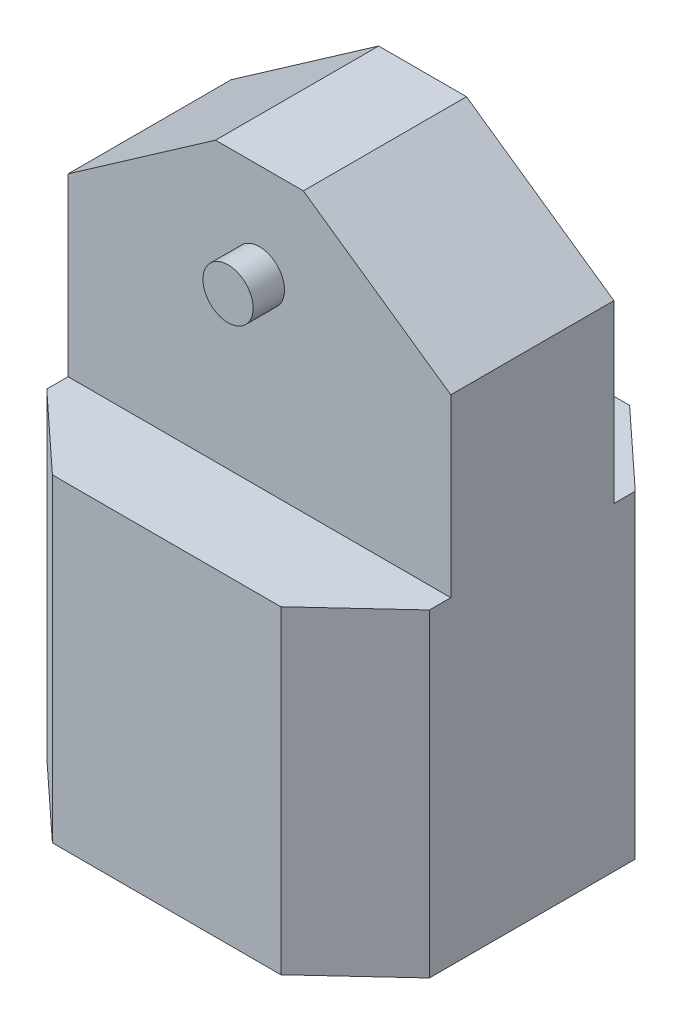
ISO-10303-21;
HEADER;
FILE_DESCRIPTION(('STEP AP214'),'2;1');
FILE_NAME('part.step','',(''),(''),'','','');
FILE_SCHEMA(('AUTOMOTIVE_DESIGN { 1 0 10303 214 1 1 1 1 }'));
ENDSEC;
DATA;
#1=APPLICATION_CONTEXT('core data for automotive mechanical design processes');
#2=APPLICATION_PROTOCOL_DEFINITION('international standard','automotive_design',2000,#1);
#3=PRODUCT_CONTEXT('',#1,'mechanical');
#4=PRODUCT('Part','Part','',(#3));
#5=PRODUCT_RELATED_PRODUCT_CATEGORY('part','',(#4));
#6=PRODUCT_DEFINITION_FORMATION('','',#4);
#7=PRODUCT_DEFINITION_CONTEXT('part definition',#1,'design');
#8=PRODUCT_DEFINITION('design','',#6,#7);
#9=PRODUCT_DEFINITION_SHAPE('','',#8);
#10=(LENGTH_UNIT() NAMED_UNIT(*) SI_UNIT(.MILLI.,.METRE.));
#11=(NAMED_UNIT(*) PLANE_ANGLE_UNIT() SI_UNIT($,.RADIAN.));
#12=(NAMED_UNIT(*) SI_UNIT($,.STERADIAN.) SOLID_ANGLE_UNIT());
#13=UNCERTAINTY_MEASURE_WITH_UNIT(LENGTH_MEASURE(1.E-05),#10,'distance_accuracy_value','');
#14=(GEOMETRIC_REPRESENTATION_CONTEXT(3) GLOBAL_UNCERTAINTY_ASSIGNED_CONTEXT((#13)) GLOBAL_UNIT_ASSIGNED_CONTEXT((#10,
#11,#12)) REPRESENTATION_CONTEXT('',''));
#15=CARTESIAN_POINT('',(0.,0.,0.));
#16=DIRECTION('',(0.,0.,1.));
#17=DIRECTION('',(1.,0.,0.));
#18=AXIS2_PLACEMENT_3D('',#15,#16,#17);
#19=CARTESIAN_POINT('',(0.806948497943091,-50.,4.08352127397604));
#20=DIRECTION('',(0.,1.,0.));
#21=DIRECTION('',(0.,0.,1.));
#22=AXIS2_PLACEMENT_3D('',#19,#20,#21);
#23=CYLINDRICAL_SURFACE('',#22,21.);
#24=CARTESIAN_POINT('',(0.806948497943091,-50.,4.08352127397604));
#25=DIRECTION('',(0.,-1.,0.));
#26=DIRECTION('',(0.,0.,-1.));
#27=AXIS2_PLACEMENT_3D('',#24,#25,#26);
#28=CIRCLE('',#27,21.);
#29=CARTESIAN_POINT('',(0.806948497943091,-50.,-16.916478726024));
#30=VERTEX_POINT('',#29);
#31=EDGE_CURVE('E11',#30,#30,#28,.T.);
#32=ORIENTED_EDGE('',*,*,#31,.F.);
#33=EDGE_LOOP('',(#32));
#34=FACE_BOUND('',#33,.T.);
#35=CARTESIAN_POINT('',(0.806948497943091,0.,4.08352127397604));
#36=DIRECTION('',(0.,-1.,0.));
#37=DIRECTION('',(0.,0.,-1.));
#38=AXIS2_PLACEMENT_3D('',#35,#36,#37);
#39=CIRCLE('',#38,21.);
#40=CARTESIAN_POINT('',(0.806948497943091,0.,-16.916478726024));
#41=VERTEX_POINT('',#40);
#42=EDGE_CURVE('E44',#41,#41,#39,.T.);
#43=ORIENTED_EDGE('',*,*,#42,.T.);
#44=EDGE_LOOP('',(#43));
#45=FACE_BOUND('',#44,.T.);
#46=ADVANCED_FACE('F41',(#34,#45),#23,.T.);
#47=CARTESIAN_POINT('',(0.806948497943091,-50.,4.08352127397604));
#48=DIRECTION('',(0.,-1.,0.));
#49=DIRECTION('',(0.,0.,-1.));
#50=AXIS2_PLACEMENT_3D('',#47,#48,#49);
#51=PLANE('',#50);
#52=ORIENTED_EDGE('',*,*,#31,.T.);
#53=EDGE_LOOP('',(#52));
#54=FACE_BOUND('',#53,.T.);
#55=ADVANCED_FACE('F56',(#54),#51,.T.);
#56=CARTESIAN_POINT('',(0.806948497943091,0.,4.08352127397604));
#57=DIRECTION('',(0.,-1.,0.));
#58=DIRECTION('',(0.,0.,-1.));
#59=AXIS2_PLACEMENT_3D('',#56,#57,#58);
#60=PLANE('',#59);
#61=ORIENTED_EDGE('',*,*,#42,.F.);
#62=EDGE_LOOP('',(#61));
#63=FACE_BOUND('',#62,.T.);
#64=ADVANCED_FACE('F54',(#63),#60,.F.);
#65=CLOSED_SHELL('',(#46,#55,#64));
#66=MANIFOLD_SOLID_BREP('B2',#65);
#67=CARTESIAN_POINT('',(153.306948497943,520.735506726257,69.0835212739761));
#68=DIRECTION('',(0.,0.,-1.));
#69=DIRECTION('',(0.,1.,0.));
#70=AXIS2_PLACEMENT_3D('',#67,#68,#69);
#71=PLANE('',#70);
#72=DIRECTION('',(0.,-1.,0.));
#73=VECTOR('',#72,1.);
#74=CARTESIAN_POINT('',(153.306948497943,520.735506726257,69.0835212739761));
#75=LINE('',#74,#73);
#76=CARTESIAN_POINT('',(153.306948497943,394.,69.0835212739761));
#77=VERTEX_POINT('',#76);
#78=CARTESIAN_POINT('',(153.306948497943,254.,69.0835212739761));
#79=VERTEX_POINT('',#78);
#80=EDGE_CURVE('E197',#77,#79,#75,.T.);
#81=ORIENTED_EDGE('',*,*,#80,.F.);
#82=DIRECTION('',(0.82005078309651,-0.572290759267351,0.));
#83=VECTOR('',#82,1.);
#84=CARTESIAN_POINT('',(153.306948497943,394.,69.0835212739761));
#85=LINE('',#84,#83);
#86=CARTESIAN_POINT('',(35.8069484979431,476.,69.0835212739761));
#87=VERTEX_POINT('',#86);
#88=EDGE_CURVE('E186',#87,#77,#85,.T.);
#89=ORIENTED_EDGE('',*,*,#88,.F.);
#90=DIRECTION('',(1.,0.,0.));
#91=VECTOR('',#90,1.);
#92=CARTESIAN_POINT('',(0.80694849794305,476.,69.083521273976));
#93=LINE('',#92,#91);
#94=CARTESIAN_POINT('',(-34.1930515020569,476.,69.0835212739761));
#95=VERTEX_POINT('',#94);
#96=EDGE_CURVE('E195',#95,#87,#93,.T.);
#97=ORIENTED_EDGE('',*,*,#96,.F.);
#98=DIRECTION('',(0.82005078309651,0.572290759267351,0.));
#99=VECTOR('',#98,1.);
#100=CARTESIAN_POINT('',(-151.693051502057,394.,69.0835212739761));
#101=LINE('',#100,#99);
#102=CARTESIAN_POINT('',(-151.693051502057,394.,69.0835212739761));
#103=VERTEX_POINT('',#102);
#104=EDGE_CURVE('E359',#103,#95,#101,.T.);
#105=ORIENTED_EDGE('',*,*,#104,.F.);
#106=DIRECTION('',(0.,-1.,0.));
#107=VECTOR('',#106,1.);
#108=CARTESIAN_POINT('',(-151.693051502057,520.735506726257,69.0835212739761));
#109=LINE('',#108,#107);
#110=CARTESIAN_POINT('',(-151.693051502057,254.,69.0835212739761));
#111=VERTEX_POINT('',#110);
#112=EDGE_CURVE('E333',#103,#111,#109,.T.);
#113=ORIENTED_EDGE('',*,*,#112,.T.);
#114=DIRECTION('',(-1.,0.,0.));
#115=VECTOR('',#114,1.);
#116=CARTESIAN_POINT('',(153.306948497943,254.,69.0835212739761));
#117=LINE('',#116,#115);
#118=EDGE_CURVE('E327',#79,#111,#117,.T.);
#119=ORIENTED_EDGE('',*,*,#118,.F.);
#120=EDGE_LOOP('',(#81,#89,#97,#105,#113,#119));
#121=FACE_BOUND('',#120,.T.);
#122=CARTESIAN_POINT('',(0.806948497943105,400.,69.0835212739761));
#123=DIRECTION('',(0.,0.,-1.));
#124=DIRECTION('',(0.,1.,0.));
#125=AXIS2_PLACEMENT_3D('',#122,#123,#124);
#126=CIRCLE('',#125,20.);
#127=CARTESIAN_POINT('',(-19.1930515020569,400.,69.0835212739761));
#128=VERTEX_POINT('',#127);
#129=EDGE_CURVE('E39',#128,#128,#126,.F.);
#130=ORIENTED_EDGE('',*,*,#129,.F.);
#131=EDGE_LOOP('',(#130));
#132=FACE_BOUND('',#131,.T.);
#133=ADVANCED_FACE('F82',(#121,#132),#71,.F.);
#134=CARTESIAN_POINT('',(153.306948497943,520.735506726257,-60.9164787260239));
#135=DIRECTION('',(0.,0.,1.));
#136=DIRECTION('',(0.,-1.,0.));
#137=AXIS2_PLACEMENT_3D('',#134,#135,#136);
#138=PLANE('',#137);
#139=DIRECTION('',(-1.,0.,0.));
#140=VECTOR('',#139,1.);
#141=CARTESIAN_POINT('',(0.80694849794305,476.,-60.916478726024));
#142=LINE('',#141,#140);
#143=CARTESIAN_POINT('',(35.8069484979431,476.,-60.916478726024));
#144=VERTEX_POINT('',#143);
#145=CARTESIAN_POINT('',(-34.1930515020569,476.,-60.916478726024));
#146=VERTEX_POINT('',#145);
#147=EDGE_CURVE('E106',#144,#146,#142,.T.);
#148=ORIENTED_EDGE('',*,*,#147,.F.);
#149=DIRECTION('',(0.82005078309651,-0.572290759267351,0.));
#150=VECTOR('',#149,1.);
#151=CARTESIAN_POINT('',(93.8290265385182,435.507996601471,-60.916478726024));
#152=LINE('',#151,#150);
#153=CARTESIAN_POINT('',(153.306948497943,394.,-60.916478726024));
#154=VERTEX_POINT('',#153);
#155=EDGE_CURVE('E187',#144,#154,#152,.T.);
#156=ORIENTED_EDGE('',*,*,#155,.T.);
#157=DIRECTION('',(0.,1.,0.));
#158=VECTOR('',#157,1.);
#159=CARTESIAN_POINT('',(153.306948497943,520.735506726257,-60.9164787260239));
#160=LINE('',#159,#158);
#161=CARTESIAN_POINT('',(153.306948497943,254.,-60.916478726024));
#162=VERTEX_POINT('',#161);
#163=EDGE_CURVE('E347',#162,#154,#160,.T.);
#164=ORIENTED_EDGE('',*,*,#163,.F.);
#165=DIRECTION('',(-1.,0.,0.));
#166=VECTOR('',#165,1.);
#167=CARTESIAN_POINT('',(153.306948497943,254.,-60.916478726024));
#168=LINE('',#167,#166);
#169=CARTESIAN_POINT('',(-151.693051502057,254.,-60.916478726024));
#170=VERTEX_POINT('',#169);
#171=EDGE_CURVE('E344',#162,#170,#168,.T.);
#172=ORIENTED_EDGE('',*,*,#171,.T.);
#173=DIRECTION('',(0.,1.,0.));
#174=VECTOR('',#173,1.);
#175=CARTESIAN_POINT('',(-151.693051502057,520.735506726257,-60.9164787260239));
#176=LINE('',#175,#174);
#177=CARTESIAN_POINT('',(-151.693051502057,394.,-60.916478726024));
#178=VERTEX_POINT('',#177);
#179=EDGE_CURVE('E348',#170,#178,#176,.T.);
#180=ORIENTED_EDGE('',*,*,#179,.T.);
#181=DIRECTION('',(0.82005078309651,0.572290759267351,0.));
#182=VECTOR('',#181,1.);
#183=CARTESIAN_POINT('',(112.892272948814,578.646779616778,-60.9164787260239));
#184=LINE('',#183,#182);
#185=EDGE_CURVE('E204',#178,#146,#184,.T.);
#186=ORIENTED_EDGE('',*,*,#185,.T.);
#187=EDGE_LOOP('',(#148,#156,#164,#172,#180,#186));
#188=FACE_BOUND('',#187,.T.);
#189=CARTESIAN_POINT('',(0.806948497943105,400.,-60.9164787260239));
#190=DIRECTION('',(0.,0.,1.));
#191=DIRECTION('',(0.,-1.,0.));
#192=AXIS2_PLACEMENT_3D('',#189,#190,#191);
#193=CIRCLE('',#192,20.);
#194=CARTESIAN_POINT('',(-19.1930515020569,400.,-60.9164787260239));
#195=VERTEX_POINT('',#194);
#196=EDGE_CURVE('E86',#195,#195,#193,.F.);
#197=ORIENTED_EDGE('',*,*,#196,.F.);
#198=EDGE_LOOP('',(#197));
#199=FACE_BOUND('',#198,.T.);
#200=ADVANCED_FACE('F219',(#188,#199),#138,.F.);
#201=CARTESIAN_POINT('',(153.306948497943,476.,-77.916478726024));
#202=DIRECTION('',(-0.679764665159936,0.,0.733430296619931));
#203=DIRECTION('',(0.733430296619931,0.,0.679764665159936));
#204=AXIS2_PLACEMENT_3D('',#201,#202,#203);
#205=PLANE('',#204);
#206=DIRECTION('',(0.,-1.,0.));
#207=VECTOR('',#206,1.);
#208=CARTESIAN_POINT('',(91.8069484979431,476.,-134.916478726024));
#209=LINE('',#208,#207);
#210=CARTESIAN_POINT('',(91.8069484979431,254.,-134.916478726024));
#211=VERTEX_POINT('',#210);
#212=CARTESIAN_POINT('',(91.8069484979431,0.,-134.916478726024));
#213=VERTEX_POINT('',#212);
#214=EDGE_CURVE('E202',#211,#213,#209,.T.);
#215=ORIENTED_EDGE('',*,*,#214,.F.);
#216=DIRECTION('',(0.733430296619931,0.,0.679764665159936));
#217=VECTOR('',#216,1.);
#218=CARTESIAN_POINT('',(153.306948497943,254.,-77.916478726024));
#219=LINE('',#218,#217);
#220=CARTESIAN_POINT('',(153.306948497943,254.,-77.916478726024));
#221=VERTEX_POINT('',#220);
#222=EDGE_CURVE('E335',#211,#221,#219,.T.);
#223=ORIENTED_EDGE('',*,*,#222,.T.);
#224=DIRECTION('',(0.,-1.,0.));
#225=VECTOR('',#224,1.);
#226=CARTESIAN_POINT('',(153.306948497943,476.,-77.916478726024));
#227=LINE('',#226,#225);
#228=CARTESIAN_POINT('',(153.306948497943,0.,-77.916478726024));
#229=VERTEX_POINT('',#228);
#230=EDGE_CURVE('E295',#221,#229,#227,.T.);
#231=ORIENTED_EDGE('',*,*,#230,.T.);
#232=DIRECTION('',(-0.733430296619931,0.,-0.679764665159936));
#233=VECTOR('',#232,1.);
#234=CARTESIAN_POINT('',(153.306948497943,0.,-77.916478726024));
#235=LINE('',#234,#233);
#236=EDGE_CURVE('E315',#229,#213,#235,.T.);
#237=ORIENTED_EDGE('',*,*,#236,.T.);
#238=EDGE_LOOP('',(#215,#223,#231,#237));
#239=FACE_BOUND('',#238,.T.);
#240=ADVANCED_FACE('F84',(#239),#205,.F.);
#241=CARTESIAN_POINT('',(-90.1930515020569,476.,-134.916478726024));
#242=DIRECTION('',(0.,0.,1.));
#243=DIRECTION('',(1.,0.,0.));
#244=AXIS2_PLACEMENT_3D('',#241,#242,#243);
#245=PLANE('',#244);
#246=DIRECTION('',(0.,-1.,0.));
#247=VECTOR('',#246,1.);
#248=CARTESIAN_POINT('',(-90.1930515020569,476.,-134.916478726024));
#249=LINE('',#248,#247);
#250=CARTESIAN_POINT('',(-90.1930515020569,254.,-134.916478726024));
#251=VERTEX_POINT('',#250);
#252=CARTESIAN_POINT('',(-90.1930515020569,0.,-134.916478726024));
#253=VERTEX_POINT('',#252);
#254=EDGE_CURVE('E206',#251,#253,#249,.T.);
#255=ORIENTED_EDGE('',*,*,#254,.F.);
#256=DIRECTION('',(1.,0.,0.));
#257=VECTOR('',#256,1.);
#258=CARTESIAN_POINT('',(-90.1930515020569,254.,-134.916478726024));
#259=LINE('',#258,#257);
#260=EDGE_CURVE('E277',#251,#211,#259,.T.);
#261=ORIENTED_EDGE('',*,*,#260,.T.);
#262=ORIENTED_EDGE('',*,*,#214,.T.);
#263=DIRECTION('',(-1.,0.,0.));
#264=VECTOR('',#263,1.);
#265=CARTESIAN_POINT('',(-90.1930515020569,0.,-134.916478726024));
#266=LINE('',#265,#264);
#267=EDGE_CURVE('E280',#213,#253,#266,.T.);
#268=ORIENTED_EDGE('',*,*,#267,.T.);
#269=EDGE_LOOP('',(#255,#261,#262,#268));
#270=FACE_BOUND('',#269,.T.);
#271=ADVANCED_FACE('F226',(#270),#245,.F.);
#272=CARTESIAN_POINT('',(-151.693051502057,476.,-77.916478726024));
#273=DIRECTION('',(0.679764665159936,0.,0.733430296619931));
#274=DIRECTION('',(0.733430296619931,0.,-0.679764665159936));
#275=AXIS2_PLACEMENT_3D('',#272,#273,#274);
#276=PLANE('',#275);
#277=DIRECTION('',(0.,-1.,0.));
#278=VECTOR('',#277,1.);
#279=CARTESIAN_POINT('',(-151.693051502057,476.,-77.916478726024));
#280=LINE('',#279,#278);
#281=CARTESIAN_POINT('',(-151.693051502057,254.,-77.916478726024));
#282=VERTEX_POINT('',#281);
#283=CARTESIAN_POINT('',(-151.693051502057,0.,-77.916478726024));
#284=VERTEX_POINT('',#283);
#285=EDGE_CURVE('E284',#282,#284,#280,.T.);
#286=ORIENTED_EDGE('',*,*,#285,.F.);
#287=DIRECTION('',(0.733430296619931,0.,-0.679764665159936));
#288=VECTOR('',#287,1.);
#289=CARTESIAN_POINT('',(-151.693051502057,254.,-77.916478726024));
#290=LINE('',#289,#288);
#291=EDGE_CURVE('E342',#282,#251,#290,.T.);
#292=ORIENTED_EDGE('',*,*,#291,.T.);
#293=ORIENTED_EDGE('',*,*,#254,.T.);
#294=DIRECTION('',(-0.733430296619931,0.,0.679764665159936));
#295=VECTOR('',#294,1.);
#296=CARTESIAN_POINT('',(-151.693051502057,0.,-77.916478726024));
#297=LINE('',#296,#295);
#298=EDGE_CURVE('E312',#253,#284,#297,.T.);
#299=ORIENTED_EDGE('',*,*,#298,.T.);
#300=EDGE_LOOP('',(#286,#292,#293,#299));
#301=FACE_BOUND('',#300,.T.);
#302=ADVANCED_FACE('F266',(#301),#276,.F.);
#303=CARTESIAN_POINT('',(-151.693051502057,476.,-77.916478726024));
#304=DIRECTION('',(1.,0.,0.));
#305=DIRECTION('',(0.,0.,-1.));
#306=AXIS2_PLACEMENT_3D('',#303,#304,#305);
#307=PLANE('',#306);
#308=ORIENTED_EDGE('',*,*,#112,.F.);
#309=DIRECTION('',(0.,0.,1.));
#310=VECTOR('',#309,1.);
#311=CARTESIAN_POINT('',(-151.693051502057,394.,-134.916478726024));
#312=LINE('',#311,#310);
#313=EDGE_CURVE('E357',#178,#103,#312,.T.);
#314=ORIENTED_EDGE('',*,*,#313,.F.);
#315=ORIENTED_EDGE('',*,*,#179,.F.);
#316=DIRECTION('',(0.,0.,1.));
#317=VECTOR('',#316,1.);
#318=CARTESIAN_POINT('',(-151.693051502057,254.,-60.916478726024));
#319=LINE('',#318,#317);
#320=EDGE_CURVE('E352',#282,#170,#319,.T.);
#321=ORIENTED_EDGE('',*,*,#320,.F.);
#322=ORIENTED_EDGE('',*,*,#285,.T.);
#323=DIRECTION('',(0.,0.,1.));
#324=VECTOR('',#323,1.);
#325=CARTESIAN_POINT('',(-151.693051502057,0.,-77.916478726024));
#326=LINE('',#325,#324);
#327=CARTESIAN_POINT('',(-151.693051502057,0.,86.0835212739761));
#328=VERTEX_POINT('',#327);
#329=EDGE_CURVE('E309',#284,#328,#326,.T.);
#330=ORIENTED_EDGE('',*,*,#329,.T.);
#331=DIRECTION('',(0.,-1.,0.));
#332=VECTOR('',#331,1.);
#333=CARTESIAN_POINT('',(-151.693051502057,476.,86.0835212739761));
#334=LINE('',#333,#332);
#335=CARTESIAN_POINT('',(-151.693051502057,254.,86.0835212739761));
#336=VERTEX_POINT('',#335);
#337=EDGE_CURVE('E285',#336,#328,#334,.T.);
#338=ORIENTED_EDGE('',*,*,#337,.F.);
#339=DIRECTION('',(0.,0.,1.));
#340=VECTOR('',#339,1.);
#341=CARTESIAN_POINT('',(-151.693051502057,254.,69.0835212739761));
#342=LINE('',#341,#340);
#343=EDGE_CURVE('E331',#111,#336,#342,.T.);
#344=ORIENTED_EDGE('',*,*,#343,.F.);
#345=EDGE_LOOP('',(#308,#314,#315,#321,#322,#330,#338,#344));
#346=FACE_BOUND('',#345,.T.);
#347=ADVANCED_FACE('F262',(#346),#307,.F.);
#348=CARTESIAN_POINT('',(-151.693051502057,476.,86.0835212739761));
#349=DIRECTION('',(0.679764665159936,0.,-0.733430296619931));
#350=DIRECTION('',(-0.733430296619931,0.,-0.679764665159936));
#351=AXIS2_PLACEMENT_3D('',#348,#349,#350);
#352=PLANE('',#351);
#353=DIRECTION('',(0.,-1.,0.));
#354=VECTOR('',#353,1.);
#355=CARTESIAN_POINT('',(-90.1930515020569,476.,143.083521273976));
#356=LINE('',#355,#354);
#357=CARTESIAN_POINT('',(-90.1930515020569,254.,143.083521273976));
#358=VERTEX_POINT('',#357);
#359=CARTESIAN_POINT('',(-90.1930515020569,0.,143.083521273976));
#360=VERTEX_POINT('',#359);
#361=EDGE_CURVE('E289',#358,#360,#356,.T.);
#362=ORIENTED_EDGE('',*,*,#361,.F.);
#363=DIRECTION('',(-0.733430296619931,0.,-0.679764665159936));
#364=VECTOR('',#363,1.);
#365=CARTESIAN_POINT('',(-151.693051502057,254.,86.0835212739761));
#366=LINE('',#365,#364);
#367=EDGE_CURVE('E318',#358,#336,#366,.T.);
#368=ORIENTED_EDGE('',*,*,#367,.T.);
#369=ORIENTED_EDGE('',*,*,#337,.T.);
#370=DIRECTION('',(0.733430296619931,0.,0.679764665159936));
#371=VECTOR('',#370,1.);
#372=CARTESIAN_POINT('',(-151.693051502057,0.,86.0835212739761));
#373=LINE('',#372,#371);
#374=EDGE_CURVE('E306',#328,#360,#373,.T.);
#375=ORIENTED_EDGE('',*,*,#374,.T.);
#376=EDGE_LOOP('',(#362,#368,#369,#375));
#377=FACE_BOUND('',#376,.T.);
#378=ADVANCED_FACE('F258',(#377),#352,.F.);
#379=CARTESIAN_POINT('',(-90.1930515020569,476.,143.083521273976));
#380=DIRECTION('',(0.,0.,-1.));
#381=DIRECTION('',(-1.,0.,0.));
#382=AXIS2_PLACEMENT_3D('',#379,#380,#381);
#383=PLANE('',#382);
#384=DIRECTION('',(0.,-1.,0.));
#385=VECTOR('',#384,1.);
#386=CARTESIAN_POINT('',(91.8069484979431,476.,143.083521273976));
#387=LINE('',#386,#385);
#388=CARTESIAN_POINT('',(91.8069484979431,254.,143.083521273976));
#389=VERTEX_POINT('',#388);
#390=CARTESIAN_POINT('',(91.8069484979431,0.,143.083521273976));
#391=VERTEX_POINT('',#390);
#392=EDGE_CURVE('E291',#389,#391,#387,.T.);
#393=ORIENTED_EDGE('',*,*,#392,.F.);
#394=DIRECTION('',(-1.,0.,0.));
#395=VECTOR('',#394,1.);
#396=CARTESIAN_POINT('',(-90.1930515020569,254.,143.083521273976));
#397=LINE('',#396,#395);
#398=EDGE_CURVE('E321',#389,#358,#397,.T.);
#399=ORIENTED_EDGE('',*,*,#398,.T.);
#400=ORIENTED_EDGE('',*,*,#361,.T.);
#401=DIRECTION('',(1.,0.,0.));
#402=VECTOR('',#401,1.);
#403=CARTESIAN_POINT('',(-90.1930515020569,0.,143.083521273976));
#404=LINE('',#403,#402);
#405=EDGE_CURVE('E303',#360,#391,#404,.T.);
#406=ORIENTED_EDGE('',*,*,#405,.T.);
#407=EDGE_LOOP('',(#393,#399,#400,#406));
#408=FACE_BOUND('',#407,.T.);
#409=ADVANCED_FACE('F254',(#408),#383,.F.);
#410=CARTESIAN_POINT('',(153.306948497943,476.,86.0835212739761));
#411=DIRECTION('',(-0.679764665159936,0.,-0.733430296619931));
#412=DIRECTION('',(-0.733430296619931,0.,0.679764665159936));
#413=AXIS2_PLACEMENT_3D('',#410,#411,#412);
#414=PLANE('',#413);
#415=DIRECTION('',(0.,-1.,0.));
#416=VECTOR('',#415,1.);
#417=CARTESIAN_POINT('',(153.306948497943,476.,86.0835212739761));
#418=LINE('',#417,#416);
#419=CARTESIAN_POINT('',(153.306948497943,254.,86.0835212739761));
#420=VERTEX_POINT('',#419);
#421=CARTESIAN_POINT('',(153.306948497943,0.,86.0835212739761));
#422=VERTEX_POINT('',#421);
#423=EDGE_CURVE('E293',#420,#422,#418,.T.);
#424=ORIENTED_EDGE('',*,*,#423,.F.);
#425=DIRECTION('',(-0.733430296619931,0.,0.679764665159936));
#426=VECTOR('',#425,1.);
#427=CARTESIAN_POINT('',(153.306948497943,254.,86.0835212739761));
#428=LINE('',#427,#426);
#429=EDGE_CURVE('E324',#420,#389,#428,.T.);
#430=ORIENTED_EDGE('',*,*,#429,.T.);
#431=ORIENTED_EDGE('',*,*,#392,.T.);
#432=DIRECTION('',(0.733430296619931,0.,-0.679764665159936));
#433=VECTOR('',#432,1.);
#434=CARTESIAN_POINT('',(153.306948497943,0.,86.0835212739761));
#435=LINE('',#434,#433);
#436=EDGE_CURVE('E300',#391,#422,#435,.T.);
#437=ORIENTED_EDGE('',*,*,#436,.T.);
#438=EDGE_LOOP('',(#424,#430,#431,#437));
#439=FACE_BOUND('',#438,.T.);
#440=ADVANCED_FACE('F250',(#439),#414,.F.);
#441=CARTESIAN_POINT('',(153.306948497943,476.,-77.916478726024));
#442=DIRECTION('',(-1.,0.,0.));
#443=DIRECTION('',(0.,0.,1.));
#444=AXIS2_PLACEMENT_3D('',#441,#442,#443);
#445=PLANE('',#444);
#446=ORIENTED_EDGE('',*,*,#163,.T.);
#447=DIRECTION('',(0.,0.,1.));
#448=VECTOR('',#447,1.);
#449=CARTESIAN_POINT('',(153.306948497943,394.,-134.916478726024));
#450=LINE('',#449,#448);
#451=EDGE_CURVE('E98',#154,#77,#450,.T.);
#452=ORIENTED_EDGE('',*,*,#451,.T.);
#453=ORIENTED_EDGE('',*,*,#80,.T.);
#454=DIRECTION('',(0.,0.,1.));
#455=VECTOR('',#454,1.);
#456=CARTESIAN_POINT('',(153.306948497943,254.,69.0835212739761));
#457=LINE('',#456,#455);
#458=EDGE_CURVE('E330',#79,#420,#457,.T.);
#459=ORIENTED_EDGE('',*,*,#458,.T.);
#460=ORIENTED_EDGE('',*,*,#423,.T.);
#461=DIRECTION('',(0.,0.,-1.));
#462=VECTOR('',#461,1.);
#463=CARTESIAN_POINT('',(153.306948497943,0.,-77.916478726024));
#464=LINE('',#463,#462);
#465=EDGE_CURVE('E297',#422,#229,#464,.T.);
#466=ORIENTED_EDGE('',*,*,#465,.T.);
#467=ORIENTED_EDGE('',*,*,#230,.F.);
#468=DIRECTION('',(0.,0.,1.));
#469=VECTOR('',#468,1.);
#470=CARTESIAN_POINT('',(153.306948497943,254.,-60.916478726024));
#471=LINE('',#470,#469);
#472=EDGE_CURVE('E351',#221,#162,#471,.T.);
#473=ORIENTED_EDGE('',*,*,#472,.T.);
#474=EDGE_LOOP('',(#446,#452,#453,#459,#460,#466,#467,#473));
#475=FACE_BOUND('',#474,.T.);
#476=ADVANCED_FACE('F244',(#475),#445,.F.);
#477=CARTESIAN_POINT('',(0.80694849794305,476.,-219.257942140658));
#478=DIRECTION('',(0.,-1.,0.));
#479=DIRECTION('',(0.,0.,-1.));
#480=AXIS2_PLACEMENT_3D('',#477,#478,#479);
#481=PLANE('',#480);
#482=ORIENTED_EDGE('',*,*,#96,.T.);
#483=DIRECTION('',(0.,0.,1.));
#484=VECTOR('',#483,1.);
#485=CARTESIAN_POINT('',(35.8069484979431,476.,-134.916478726024));
#486=LINE('',#485,#484);
#487=EDGE_CURVE('E183',#144,#87,#486,.T.);
#488=ORIENTED_EDGE('',*,*,#487,.F.);
#489=ORIENTED_EDGE('',*,*,#147,.T.);
#490=DIRECTION('',(0.,0.,1.));
#491=VECTOR('',#490,1.);
#492=CARTESIAN_POINT('',(-34.1930515020569,476.,-134.916478726024));
#493=LINE('',#492,#491);
#494=EDGE_CURVE('E201',#146,#95,#493,.T.);
#495=ORIENTED_EDGE('',*,*,#494,.T.);
#496=EDGE_LOOP('',(#482,#488,#489,#495));
#497=FACE_BOUND('',#496,.T.);
#498=ADVANCED_FACE('F200',(#497),#481,.F.);
#499=CARTESIAN_POINT('',(0.80694849794305,0.,-219.257942140658));
#500=DIRECTION('',(0.,-1.,0.));
#501=DIRECTION('',(0.,0.,-1.));
#502=AXIS2_PLACEMENT_3D('',#499,#500,#501);
#503=PLANE('',#502);
#504=ORIENTED_EDGE('',*,*,#236,.F.);
#505=ORIENTED_EDGE('',*,*,#465,.F.);
#506=ORIENTED_EDGE('',*,*,#436,.F.);
#507=ORIENTED_EDGE('',*,*,#405,.F.);
#508=ORIENTED_EDGE('',*,*,#374,.F.);
#509=ORIENTED_EDGE('',*,*,#329,.F.);
#510=ORIENTED_EDGE('',*,*,#298,.F.);
#511=ORIENTED_EDGE('',*,*,#267,.F.);
#512=EDGE_LOOP('',(#504,#505,#506,#507,#508,#509,#510,#511));
#513=FACE_BOUND('',#512,.T.);
#514=ADVANCED_FACE('F239',(#513),#503,.T.);
#515=CARTESIAN_POINT('',(153.306948497943,254.,69.0835212739761));
#516=DIRECTION('',(0.,-1.,0.));
#517=DIRECTION('',(0.,0.,-1.));
#518=AXIS2_PLACEMENT_3D('',#515,#516,#517);
#519=PLANE('',#518);
#520=ORIENTED_EDGE('',*,*,#398,.F.);
#521=ORIENTED_EDGE('',*,*,#429,.F.);
#522=ORIENTED_EDGE('',*,*,#458,.F.);
#523=ORIENTED_EDGE('',*,*,#118,.T.);
#524=ORIENTED_EDGE('',*,*,#343,.T.);
#525=ORIENTED_EDGE('',*,*,#367,.F.);
#526=EDGE_LOOP('',(#520,#521,#522,#523,#524,#525));
#527=FACE_BOUND('',#526,.T.);
#528=ADVANCED_FACE('F236',(#527),#519,.F.);
#529=CARTESIAN_POINT('',(153.306948497943,254.,-60.916478726024));
#530=DIRECTION('',(0.,-1.,0.));
#531=DIRECTION('',(0.,0.,-1.));
#532=AXIS2_PLACEMENT_3D('',#529,#530,#531);
#533=PLANE('',#532);
#534=ORIENTED_EDGE('',*,*,#260,.F.);
#535=ORIENTED_EDGE('',*,*,#291,.F.);
#536=ORIENTED_EDGE('',*,*,#320,.T.);
#537=ORIENTED_EDGE('',*,*,#171,.F.);
#538=ORIENTED_EDGE('',*,*,#472,.F.);
#539=ORIENTED_EDGE('',*,*,#222,.F.);
#540=EDGE_LOOP('',(#534,#535,#536,#537,#538,#539));
#541=FACE_BOUND('',#540,.T.);
#542=ADVANCED_FACE('F233',(#541),#533,.F.);
#543=CARTESIAN_POINT('',(-151.693051502057,394.,-134.916478726024));
#544=DIRECTION('',(0.572290759267351,-0.82005078309651,0.));
#545=DIRECTION('',(0.82005078309651,0.572290759267351,0.));
#546=AXIS2_PLACEMENT_3D('',#543,#544,#545);
#547=PLANE('',#546);
#548=ORIENTED_EDGE('',*,*,#313,.T.);
#549=ORIENTED_EDGE('',*,*,#104,.T.);
#550=ORIENTED_EDGE('',*,*,#494,.F.);
#551=ORIENTED_EDGE('',*,*,#185,.F.);
#552=EDGE_LOOP('',(#548,#549,#550,#551));
#553=FACE_BOUND('',#552,.T.);
#554=ADVANCED_FACE('F231',(#553),#547,.F.);
#555=CARTESIAN_POINT('',(153.306948497943,394.,-134.916478726024));
#556=DIRECTION('',(-0.572290759267351,-0.82005078309651,0.));
#557=DIRECTION('',(0.82005078309651,-0.572290759267351,0.));
#558=AXIS2_PLACEMENT_3D('',#555,#556,#557);
#559=PLANE('',#558);
#560=ORIENTED_EDGE('',*,*,#487,.T.);
#561=ORIENTED_EDGE('',*,*,#88,.T.);
#562=ORIENTED_EDGE('',*,*,#451,.F.);
#563=ORIENTED_EDGE('',*,*,#155,.F.);
#564=EDGE_LOOP('',(#560,#561,#562,#563));
#565=FACE_BOUND('',#564,.T.);
#566=ADVANCED_FACE('F185',(#565),#559,.F.);
#567=CARTESIAN_POINT('',(0.806948497943105,400.,-85.9164787260239));
#568=DIRECTION('',(0.,0.,1.));
#569=DIRECTION('',(1.,0.,0.));
#570=AXIS2_PLACEMENT_3D('',#567,#568,#569);
#571=PLANE('',#570);
#572=CARTESIAN_POINT('',(0.806948497943105,400.,-85.9164787260239));
#573=DIRECTION('',(0.,0.,1.));
#574=DIRECTION('',(1.,0.,0.));
#575=AXIS2_PLACEMENT_3D('',#572,#573,#574);
#576=CIRCLE('',#575,20.);
#577=CARTESIAN_POINT('',(-19.1930515020569,400.,-85.9164787260239));
#578=VERTEX_POINT('',#577);
#579=EDGE_CURVE('E363',#578,#578,#576,.T.);
#580=ORIENTED_EDGE('',*,*,#579,.F.);
#581=EDGE_LOOP('',(#580));
#582=FACE_BOUND('',#581,.T.);
#583=ADVANCED_FACE('F381',(#582),#571,.F.);
#584=CARTESIAN_POINT('',(0.806948497943105,400.,94.0835212739761));
#585=DIRECTION('',(0.,0.,-1.));
#586=DIRECTION('',(-1.,0.,0.));
#587=AXIS2_PLACEMENT_3D('',#584,#585,#586);
#588=CYLINDRICAL_SURFACE('',#587,20.);
#589=CARTESIAN_POINT('',(-19.1930515020569,400.,-85.9164787260239));
#590=CARTESIAN_POINT('',(-19.1930515020569,400.,-85.6560620593572));
#591=CARTESIAN_POINT('',(-19.1930515020569,400.,-85.3956453926906));
#592=CARTESIAN_POINT('',(-19.1930515020569,400.,-84.8748120593572));
#593=CARTESIAN_POINT('',(-19.1930515020569,400.,-84.6143953926906));
#594=CARTESIAN_POINT('',(-19.1930515020569,400.,-84.0935620593573));
#595=CARTESIAN_POINT('',(-19.1930515020569,400.,-83.8331453926906));
#596=CARTESIAN_POINT('',(-19.1930515020569,400.,-83.3123120593572));
#597=CARTESIAN_POINT('',(-19.1930515020569,400.,-83.0518953926906));
#598=CARTESIAN_POINT('',(-19.1930515020569,400.,-82.5310620593573));
#599=CARTESIAN_POINT('',(-19.1930515020569,400.,-82.2706453926906));
#600=CARTESIAN_POINT('',(-19.1930515020569,400.,-81.7498120593572));
#601=CARTESIAN_POINT('',(-19.1930515020569,400.,-81.4893953926906));
#602=CARTESIAN_POINT('',(-19.1930515020569,400.,-80.9685620593573));
#603=CARTESIAN_POINT('',(-19.1930515020569,400.,-80.7081453926906));
#604=CARTESIAN_POINT('',(-19.1930515020569,400.,-80.1873120593573));
#605=CARTESIAN_POINT('',(-19.1930515020569,400.,-79.9268953926906));
#606=CARTESIAN_POINT('',(-19.1930515020569,400.,-79.4060620593573));
#607=CARTESIAN_POINT('',(-19.1930515020569,400.,-79.1456453926906));
#608=CARTESIAN_POINT('',(-19.1930515020569,400.,-78.6248120593573));
#609=CARTESIAN_POINT('',(-19.1930515020569,400.,-78.3643953926906));
#610=CARTESIAN_POINT('',(-19.1930515020569,400.,-77.8435620593572));
#611=CARTESIAN_POINT('',(-19.1930515020569,400.,-77.5831453926906));
#612=CARTESIAN_POINT('',(-19.1930515020569,400.,-77.0623120593573));
#613=CARTESIAN_POINT('',(-19.1930515020569,400.,-76.8018953926906));
#614=CARTESIAN_POINT('',(-19.1930515020569,400.,-76.2810620593573));
#615=CARTESIAN_POINT('',(-19.1930515020569,400.,-76.0206453926906));
#616=CARTESIAN_POINT('',(-19.1930515020569,400.,-75.4998120593573));
#617=CARTESIAN_POINT('',(-19.1930515020569,400.,-75.2393953926906));
#618=CARTESIAN_POINT('',(-19.1930515020569,400.,-74.7185620593573));
#619=CARTESIAN_POINT('',(-19.1930515020569,400.,-74.4581453926906));
#620=CARTESIAN_POINT('',(-19.1930515020569,400.,-73.9373120593573));
#621=CARTESIAN_POINT('',(-19.1930515020569,400.,-73.6768953926906));
#622=CARTESIAN_POINT('',(-19.1930515020569,400.,-73.1560620593573));
#623=CARTESIAN_POINT('',(-19.1930515020569,400.,-72.8956453926906));
#624=CARTESIAN_POINT('',(-19.1930515020569,400.,-72.3748120593573));
#625=CARTESIAN_POINT('',(-19.1930515020569,400.,-72.1143953926906));
#626=CARTESIAN_POINT('',(-19.1930515020569,400.,-71.5935620593573));
#627=CARTESIAN_POINT('',(-19.1930515020569,400.,-71.3331453926906));
#628=CARTESIAN_POINT('',(-19.1930515020569,400.,-70.8123120593573));
#629=CARTESIAN_POINT('',(-19.1930515020569,400.,-70.5518953926906));
#630=CARTESIAN_POINT('',(-19.1930515020569,400.,-70.0310620593573));
#631=CARTESIAN_POINT('',(-19.1930515020569,400.,-69.7706453926906));
#632=CARTESIAN_POINT('',(-19.1930515020569,400.,-69.2498120593573));
#633=CARTESIAN_POINT('',(-19.1930515020569,400.,-68.9893953926906));
#634=CARTESIAN_POINT('',(-19.1930515020569,400.,-68.4685620593573));
#635=CARTESIAN_POINT('',(-19.1930515020569,400.,-68.2081453926906));
#636=CARTESIAN_POINT('',(-19.1930515020569,400.,-67.6873120593573));
#637=CARTESIAN_POINT('',(-19.1930515020569,400.,-67.4268953926906));
#638=CARTESIAN_POINT('',(-19.1930515020569,400.,-66.9060620593573));
#639=CARTESIAN_POINT('',(-19.1930515020569,400.,-66.6456453926906));
#640=CARTESIAN_POINT('',(-19.1930515020569,400.,-66.1248120593573));
#641=CARTESIAN_POINT('',(-19.1930515020569,400.,-65.8643953926906));
#642=CARTESIAN_POINT('',(-19.1930515020569,400.,-65.3435620593573));
#643=CARTESIAN_POINT('',(-19.1930515020569,400.,-65.0831453926906));
#644=CARTESIAN_POINT('',(-19.1930515020569,400.,-64.5623120593573));
#645=CARTESIAN_POINT('',(-19.1930515020569,400.,-64.3018953926906));
#646=CARTESIAN_POINT('',(-19.1930515020569,400.,-63.7810620593573));
#647=CARTESIAN_POINT('',(-19.1930515020569,400.,-63.5206453926906));
#648=CARTESIAN_POINT('',(-19.1930515020569,400.,-62.9998120593573));
#649=CARTESIAN_POINT('',(-19.1930515020569,400.,-62.7393953926906));
#650=CARTESIAN_POINT('',(-19.1930515020569,400.,-62.2185620593573));
#651=CARTESIAN_POINT('',(-19.1930515020569,400.,-61.9581453926906));
#652=CARTESIAN_POINT('',(-19.1930515020569,400.,-61.4373120593573));
#653=CARTESIAN_POINT('',(-19.1930515020569,400.,-61.1768953926906));
#654=CARTESIAN_POINT('',(-19.1930515020569,400.,-60.9164787260239));
#655=B_SPLINE_CURVE_WITH_KNOTS('',3,(#589,#590,#591,#592,#593,#594,#595,#596,#597,#598,#599,
#600,#601,#602,#603,#604,#605,#606,#607,#608,#609,#610,#611,#612,#613,#614,#615,#616,#617,#618,
#619,#620,#621,#622,#623,#624,#625,#626,#627,#628,#629,#630,#631,#632,#633,#634,#635,#636,#637,
#638,#639,#640,#641,#642,#643,#644,#645,#646,#647,#648,#649,#650,#651,#652,#653,#654),
.UNSPECIFIED.,.F.,.F.,(4,2,2,2,2,2,2,2,2,2,2,2,2,2,2,2,2,2,2,2,2,2,2,2,2,2,2,2,2,2,2,2,4),(0.,
0.781250000000011,1.56249999999999,2.34375000000001,3.12499999999999,3.90625,4.68749999999998,
5.46874999999999,6.24999999999998,7.03124999999999,7.8125,8.59374999999998,9.37499999999999,
10.15625,10.9375,11.71875,12.5,13.28125,14.0625,14.84375,15.625,16.40625,17.1875,17.96875,18.75,
19.53125,20.3125,21.09375,21.875,22.65625,23.4375,24.21875,25.),.UNSPECIFIED.);
#656=EDGE_CURVE('BSEAM217',#578,#195,#655,.T.);
#657=ORIENTED_EDGE('',*,*,#579,.T.);
#658=ORIENTED_EDGE('',*,*,#196,.T.);
#659=ORIENTED_EDGE('',*,*,#656,.T.);
#660=ORIENTED_EDGE('',*,*,#656,.F.);
#661=EDGE_LOOP('',(#657,#659,#658,#660));
#662=FACE_BOUND('',#661,.T.);
#663=ADVANCED_FACE('F217',(#662),#588,.T.);
#664=CARTESIAN_POINT('',(0.806948497943105,400.,94.0835212739761));
#665=DIRECTION('',(0.,0.,1.));
#666=DIRECTION('',(1.,0.,0.));
#667=AXIS2_PLACEMENT_3D('',#664,#665,#666);
#668=CIRCLE('',#667,20.);
#669=CARTESIAN_POINT('',(-19.1930515020569,400.,94.0835212739761));
#670=VERTEX_POINT('',#669);
#671=EDGE_CURVE('E198',#670,#670,#668,.T.);
#672=CARTESIAN_POINT('',(-19.1930515020569,400.,94.0835212739761));
#673=CARTESIAN_POINT('',(-19.1930515020569,400.,93.8231046073094));
#674=CARTESIAN_POINT('',(-19.1930515020569,400.,93.5626879406428));
#675=CARTESIAN_POINT('',(-19.1930515020569,400.,93.0418546073094));
#676=CARTESIAN_POINT('',(-19.1930515020569,400.,92.7814379406428));
#677=CARTESIAN_POINT('',(-19.1930515020569,400.,92.2606046073094));
#678=CARTESIAN_POINT('',(-19.1930515020569,400.,92.0001879406428));
#679=CARTESIAN_POINT('',(-19.1930515020569,400.,91.4793546073094));
#680=CARTESIAN_POINT('',(-19.1930515020569,400.,91.2189379406428));
#681=CARTESIAN_POINT('',(-19.1930515020569,400.,90.6981046073094));
#682=CARTESIAN_POINT('',(-19.1930515020569,400.,90.4376879406428));
#683=CARTESIAN_POINT('',(-19.1930515020569,400.,89.9168546073094));
#684=CARTESIAN_POINT('',(-19.1930515020569,400.,89.6564379406428));
#685=CARTESIAN_POINT('',(-19.1930515020569,400.,89.1356046073094));
#686=CARTESIAN_POINT('',(-19.1930515020569,400.,88.8751879406428));
#687=CARTESIAN_POINT('',(-19.1930515020569,400.,88.3543546073094));
#688=CARTESIAN_POINT('',(-19.1930515020569,400.,88.0939379406428));
#689=CARTESIAN_POINT('',(-19.1930515020569,400.,87.5731046073094));
#690=CARTESIAN_POINT('',(-19.1930515020569,400.,87.3126879406428));
#691=CARTESIAN_POINT('',(-19.1930515020569,400.,86.7918546073094));
#692=CARTESIAN_POINT('',(-19.1930515020569,400.,86.5314379406428));
#693=CARTESIAN_POINT('',(-19.1930515020569,400.,86.0106046073094));
#694=CARTESIAN_POINT('',(-19.1930515020569,400.,85.7501879406428));
#695=CARTESIAN_POINT('',(-19.1930515020569,400.,85.2293546073094));
#696=CARTESIAN_POINT('',(-19.1930515020569,400.,84.9689379406428));
#697=CARTESIAN_POINT('',(-19.1930515020569,400.,84.4481046073094));
#698=CARTESIAN_POINT('',(-19.1930515020569,400.,84.1876879406428));
#699=CARTESIAN_POINT('',(-19.1930515020569,400.,83.6668546073094));
#700=CARTESIAN_POINT('',(-19.1930515020569,400.,83.4064379406428));
#701=CARTESIAN_POINT('',(-19.1930515020569,400.,82.8856046073094));
#702=CARTESIAN_POINT('',(-19.1930515020569,400.,82.6251879406428));
#703=CARTESIAN_POINT('',(-19.1930515020569,400.,82.1043546073094));
#704=CARTESIAN_POINT('',(-19.1930515020569,400.,81.8439379406428));
#705=CARTESIAN_POINT('',(-19.1930515020569,400.,81.3231046073094));
#706=CARTESIAN_POINT('',(-19.1930515020569,400.,81.0626879406427));
#707=CARTESIAN_POINT('',(-19.1930515020569,400.,80.5418546073094));
#708=CARTESIAN_POINT('',(-19.1930515020569,400.,80.2814379406428));
#709=CARTESIAN_POINT('',(-19.1930515020569,400.,79.7606046073094));
#710=CARTESIAN_POINT('',(-19.1930515020569,400.,79.5001879406428));
#711=CARTESIAN_POINT('',(-19.1930515020569,400.,78.9793546073094));
#712=CARTESIAN_POINT('',(-19.1930515020569,400.,78.7189379406428));
#713=CARTESIAN_POINT('',(-19.1930515020569,400.,78.1981046073094));
#714=CARTESIAN_POINT('',(-19.1930515020569,400.,77.9376879406427));
#715=CARTESIAN_POINT('',(-19.1930515020569,400.,77.4168546073094));
#716=CARTESIAN_POINT('',(-19.1930515020569,400.,77.1564379406427));
#717=CARTESIAN_POINT('',(-19.1930515020569,400.,76.6356046073094));
#718=CARTESIAN_POINT('',(-19.1930515020569,400.,76.3751879406428));
#719=CARTESIAN_POINT('',(-19.1930515020569,400.,75.8543546073094));
#720=CARTESIAN_POINT('',(-19.1930515020569,400.,75.5939379406428));
#721=CARTESIAN_POINT('',(-19.1930515020569,400.,75.0731046073094));
#722=CARTESIAN_POINT('',(-19.1930515020569,400.,74.8126879406428));
#723=CARTESIAN_POINT('',(-19.1930515020569,400.,74.2918546073094));
#724=CARTESIAN_POINT('',(-19.1930515020569,400.,74.0314379406427));
#725=CARTESIAN_POINT('',(-19.1930515020569,400.,73.5106046073094));
#726=CARTESIAN_POINT('',(-19.1930515020569,400.,73.2501879406427));
#727=CARTESIAN_POINT('',(-19.1930515020569,400.,72.7293546073094));
#728=CARTESIAN_POINT('',(-19.1930515020569,400.,72.4689379406428));
#729=CARTESIAN_POINT('',(-19.1930515020569,400.,71.9481046073094));
#730=CARTESIAN_POINT('',(-19.1930515020569,400.,71.6876879406427));
#731=CARTESIAN_POINT('',(-19.1930515020569,400.,71.1668546073094));
#732=CARTESIAN_POINT('',(-19.1930515020569,400.,70.9064379406427));
#733=CARTESIAN_POINT('',(-19.1930515020569,400.,70.3856046073094));
#734=CARTESIAN_POINT('',(-19.1930515020569,400.,70.1251879406427));
#735=CARTESIAN_POINT('',(-19.1930515020569,400.,69.6043546073094));
#736=CARTESIAN_POINT('',(-19.1930515020569,400.,69.3439379406427));
#737=CARTESIAN_POINT('',(-19.1930515020569,400.,69.0835212739761));
#738=B_SPLINE_CURVE_WITH_KNOTS('',3,(#672,#673,#674,#675,#676,#677,#678,#679,#680,#681,#682,
#683,#684,#685,#686,#687,#688,#689,#690,#691,#692,#693,#694,#695,#696,#697,#698,#699,#700,#701,
#702,#703,#704,#705,#706,#707,#708,#709,#710,#711,#712,#713,#714,#715,#716,#717,#718,#719,#720,
#721,#722,#723,#724,#725,#726,#727,#728,#729,#730,#731,#732,#733,#734,#735,#736,#737),
.UNSPECIFIED.,.F.,.F.,(4,2,2,2,2,2,2,2,2,2,2,2,2,2,2,2,2,2,2,2,2,2,2,2,2,2,2,2,2,2,2,2,4),(0.,
0.781249999999997,1.56249999999999,2.34374999999999,3.12499999999999,3.90625,4.6875,
5.46874999999999,6.24999999999999,7.03125,7.8125,8.59375,9.37499999999999,10.15625,10.9375,
11.71875,12.5,13.28125,14.0625,14.84375,15.625,16.40625,17.1875,17.96875,18.75,19.53125,20.3125,
21.09375,21.875,22.65625,23.4375,24.21875,25.),.UNSPECIFIED.);
#739=EDGE_CURVE('BSEAM371',#670,#128,#738,.T.);
#740=ORIENTED_EDGE('',*,*,#671,.F.);
#741=ORIENTED_EDGE('',*,*,#129,.T.);
#742=ORIENTED_EDGE('',*,*,#739,.T.);
#743=ORIENTED_EDGE('',*,*,#739,.F.);
#744=EDGE_LOOP('',(#740,#742,#741,#743));
#745=FACE_BOUND('',#744,.T.);
#746=ADVANCED_FACE('F371',(#745),#588,.T.);
#747=CARTESIAN_POINT('',(0.806948497943105,400.,94.0835212739761));
#748=DIRECTION('',(0.,0.,1.));
#749=DIRECTION('',(1.,0.,0.));
#750=AXIS2_PLACEMENT_3D('',#747,#748,#749);
#751=PLANE('',#750);
#752=ORIENTED_EDGE('',*,*,#671,.T.);
#753=EDGE_LOOP('',(#752));
#754=FACE_BOUND('',#753,.T.);
#755=ADVANCED_FACE('F369',(#754),#751,.T.);
#756=CLOSED_SHELL('',(#133,#200,#240,#271,#302,#347,#378,#409,#440,#476,#498,#514,#528,#542,
#554,#566,#583,#663,#746,#755));
#757=MANIFOLD_SOLID_BREP('B6',#756);
#758=ADVANCED_BREP_SHAPE_REPRESENTATION('',(#18,#66,#757),#14);
#759=SHAPE_DEFINITION_REPRESENTATION(#9,#758);
ENDSEC;
END-ISO-10303-21;
